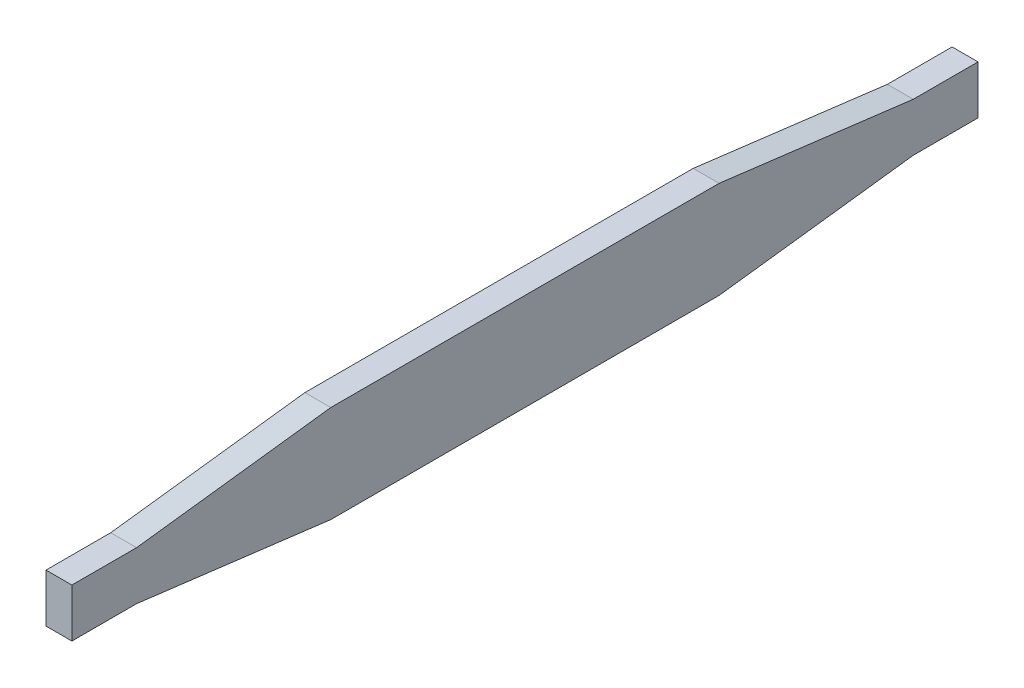
ISO-10303-21;
HEADER;
FILE_DESCRIPTION(('STEP AP214'),'2;1');
FILE_NAME('part.step','',(''),(''),'','','');
FILE_SCHEMA(('AUTOMOTIVE_DESIGN { 1 0 10303 214 1 1 1 1 }'));
ENDSEC;
DATA;
#1=APPLICATION_CONTEXT('core data for automotive mechanical design processes');
#2=APPLICATION_PROTOCOL_DEFINITION('international standard','automotive_design',2000,#1);
#3=PRODUCT_CONTEXT('',#1,'mechanical');
#4=PRODUCT('Part','Part','',(#3));
#5=PRODUCT_RELATED_PRODUCT_CATEGORY('part','',(#4));
#6=PRODUCT_DEFINITION_FORMATION('','',#4);
#7=PRODUCT_DEFINITION_CONTEXT('part definition',#1,'design');
#8=PRODUCT_DEFINITION('design','',#6,#7);
#9=PRODUCT_DEFINITION_SHAPE('','',#8);
#10=(LENGTH_UNIT() NAMED_UNIT(*) SI_UNIT(.MILLI.,.METRE.));
#11=(NAMED_UNIT(*) PLANE_ANGLE_UNIT() SI_UNIT($,.RADIAN.));
#12=(NAMED_UNIT(*) SI_UNIT($,.STERADIAN.) SOLID_ANGLE_UNIT());
#13=UNCERTAINTY_MEASURE_WITH_UNIT(LENGTH_MEASURE(1.E-05),#10,'distance_accuracy_value','');
#14=(GEOMETRIC_REPRESENTATION_CONTEXT(3) GLOBAL_UNCERTAINTY_ASSIGNED_CONTEXT((#13)) GLOBAL_UNIT_ASSIGNED_CONTEXT((#10,
#11,#12)) REPRESENTATION_CONTEXT('',''));
#15=CARTESIAN_POINT('',(0.,0.,0.));
#16=DIRECTION('',(0.,0.,1.));
#17=DIRECTION('',(1.,0.,0.));
#18=AXIS2_PLACEMENT_3D('',#15,#16,#17);
#19=CARTESIAN_POINT('',(4.,-7.5,0.));
#20=DIRECTION('',(0.,1.,0.));
#21=DIRECTION('',(0.,0.,1.));
#22=AXIS2_PLACEMENT_3D('',#19,#20,#21);
#23=PLANE('',#22);
#24=DIRECTION('',(0.,0.,-1.));
#25=VECTOR('',#24,1.);
#26=CARTESIAN_POINT('',(0.,-7.5,0.));
#27=LINE('',#26,#25);
#28=CARTESIAN_POINT('',(0.,-7.5,30.));
#29=VERTEX_POINT('',#28);
#30=CARTESIAN_POINT('',(0.,-7.5,-30.));
#31=VERTEX_POINT('',#30);
#32=EDGE_CURVE('E152',#29,#31,#27,.T.);
#33=ORIENTED_EDGE('',*,*,#32,.T.);
#34=DIRECTION('',(-1.,0.,0.));
#35=VECTOR('',#34,1.);
#36=CARTESIAN_POINT('',(4.,-7.5,-30.));
#37=LINE('',#36,#35);
#38=CARTESIAN_POINT('',(4.,-7.5,-30.));
#39=VERTEX_POINT('',#38);
#40=EDGE_CURVE('E11',#39,#31,#37,.T.);
#41=ORIENTED_EDGE('',*,*,#40,.F.);
#42=DIRECTION('',(0.,0.,-1.));
#43=VECTOR('',#42,1.);
#44=CARTESIAN_POINT('',(4.,-7.5,0.));
#45=LINE('',#44,#43);
#46=CARTESIAN_POINT('',(4.,-7.5,30.));
#47=VERTEX_POINT('',#46);
#48=EDGE_CURVE('E99',#47,#39,#45,.T.);
#49=ORIENTED_EDGE('',*,*,#48,.F.);
#50=DIRECTION('',(-1.,0.,0.));
#51=VECTOR('',#50,1.);
#52=CARTESIAN_POINT('',(4.,-7.5,30.));
#53=LINE('',#52,#51);
#54=EDGE_CURVE('E148',#47,#29,#53,.T.);
#55=ORIENTED_EDGE('',*,*,#54,.T.);
#56=EDGE_LOOP('',(#33,#41,#49,#55));
#57=FACE_BOUND('',#56,.T.);
#58=ADVANCED_FACE('F35',(#57),#23,.F.);
#59=CARTESIAN_POINT('',(4.,-11.0769230769231,-1.38461538461538));
#60=DIRECTION('',(0.,-0.992277876713668,-0.124034734589208));
#61=DIRECTION('',(0.,0.124034734589208,-0.992277876713668));
#62=AXIS2_PLACEMENT_3D('',#59,#60,#61);
#63=PLANE('',#62);
#64=DIRECTION('',(0.,-0.124034734589208,0.992277876713668));
#65=VECTOR('',#64,1.);
#66=CARTESIAN_POINT('',(0.,-11.0769230769231,-1.38461538461538));
#67=LINE('',#66,#65);
#68=CARTESIAN_POINT('',(0.,-3.75,-60.));
#69=VERTEX_POINT('',#68);
#70=EDGE_CURVE('E155',#69,#31,#67,.T.);
#71=ORIENTED_EDGE('',*,*,#70,.F.);
#72=DIRECTION('',(-1.,0.,0.));
#73=VECTOR('',#72,1.);
#74=CARTESIAN_POINT('',(4.,-3.75,-60.));
#75=LINE('',#74,#73);
#76=CARTESIAN_POINT('',(4.,-3.75,-60.));
#77=VERTEX_POINT('',#76);
#78=EDGE_CURVE('E43',#77,#69,#75,.T.);
#79=ORIENTED_EDGE('',*,*,#78,.F.);
#80=DIRECTION('',(0.,-0.124034734589208,0.992277876713668));
#81=VECTOR('',#80,1.);
#82=CARTESIAN_POINT('',(4.,-11.0769230769231,-1.38461538461538));
#83=LINE('',#82,#81);
#84=EDGE_CURVE('E211',#77,#39,#83,.T.);
#85=ORIENTED_EDGE('',*,*,#84,.T.);
#86=ORIENTED_EDGE('',*,*,#40,.T.);
#87=EDGE_LOOP('',(#71,#79,#85,#86));
#88=FACE_BOUND('',#87,.T.);
#89=ADVANCED_FACE('F210',(#88),#63,.T.);
#90=CARTESIAN_POINT('',(4.,-3.75,0.));
#91=DIRECTION('',(0.,1.,0.));
#92=DIRECTION('',(0.,0.,1.));
#93=AXIS2_PLACEMENT_3D('',#90,#91,#92);
#94=PLANE('',#93);
#95=DIRECTION('',(0.,0.,-1.));
#96=VECTOR('',#95,1.);
#97=CARTESIAN_POINT('',(0.,-3.75,0.));
#98=LINE('',#97,#96);
#99=CARTESIAN_POINT('',(0.,-3.75,-70.));
#100=VERTEX_POINT('',#99);
#101=EDGE_CURVE('E158',#69,#100,#98,.T.);
#102=ORIENTED_EDGE('',*,*,#101,.T.);
#103=DIRECTION('',(-1.,0.,0.));
#104=VECTOR('',#103,1.);
#105=CARTESIAN_POINT('',(4.,-3.75,-70.));
#106=LINE('',#105,#104);
#107=CARTESIAN_POINT('',(4.,-3.75,-70.));
#108=VERTEX_POINT('',#107);
#109=EDGE_CURVE('E195',#108,#100,#106,.T.);
#110=ORIENTED_EDGE('',*,*,#109,.F.);
#111=DIRECTION('',(0.,0.,-1.));
#112=VECTOR('',#111,1.);
#113=CARTESIAN_POINT('',(4.,-3.75,0.));
#114=LINE('',#113,#112);
#115=EDGE_CURVE('E202',#77,#108,#114,.T.);
#116=ORIENTED_EDGE('',*,*,#115,.F.);
#117=ORIENTED_EDGE('',*,*,#78,.T.);
#118=EDGE_LOOP('',(#102,#110,#116,#117));
#119=FACE_BOUND('',#118,.T.);
#120=ADVANCED_FACE('F200',(#119),#94,.F.);
#121=CARTESIAN_POINT('',(4.,0.,-70.));
#122=DIRECTION('',(0.,0.,1.));
#123=DIRECTION('',(1.,0.,0.));
#124=AXIS2_PLACEMENT_3D('',#121,#122,#123);
#125=PLANE('',#124);
#126=DIRECTION('',(0.,1.,0.));
#127=VECTOR('',#126,1.);
#128=CARTESIAN_POINT('',(0.,0.,-70.));
#129=LINE('',#128,#127);
#130=CARTESIAN_POINT('',(0.,3.75,-70.));
#131=VERTEX_POINT('',#130);
#132=EDGE_CURVE('E160',#100,#131,#129,.T.);
#133=ORIENTED_EDGE('',*,*,#132,.T.);
#134=DIRECTION('',(-1.,0.,0.));
#135=VECTOR('',#134,1.);
#136=CARTESIAN_POINT('',(4.,3.75,-70.));
#137=LINE('',#136,#135);
#138=CARTESIAN_POINT('',(4.,3.75,-70.));
#139=VERTEX_POINT('',#138);
#140=EDGE_CURVE('E193',#139,#131,#137,.T.);
#141=ORIENTED_EDGE('',*,*,#140,.F.);
#142=DIRECTION('',(0.,1.,0.));
#143=VECTOR('',#142,1.);
#144=CARTESIAN_POINT('',(4.,0.,-70.));
#145=LINE('',#144,#143);
#146=EDGE_CURVE('E244',#108,#139,#145,.T.);
#147=ORIENTED_EDGE('',*,*,#146,.F.);
#148=ORIENTED_EDGE('',*,*,#109,.T.);
#149=EDGE_LOOP('',(#133,#141,#147,#148));
#150=FACE_BOUND('',#149,.T.);
#151=ADVANCED_FACE('F243',(#150),#125,.F.);
#152=CARTESIAN_POINT('',(4.,3.75,0.));
#153=DIRECTION('',(0.,1.,0.));
#154=DIRECTION('',(0.,0.,1.));
#155=AXIS2_PLACEMENT_3D('',#152,#153,#154);
#156=PLANE('',#155);
#157=DIRECTION('',(0.,0.,-1.));
#158=VECTOR('',#157,1.);
#159=CARTESIAN_POINT('',(0.,3.75,0.));
#160=LINE('',#159,#158);
#161=CARTESIAN_POINT('',(0.,3.75,-60.));
#162=VERTEX_POINT('',#161);
#163=EDGE_CURVE('E163',#162,#131,#160,.T.);
#164=ORIENTED_EDGE('',*,*,#163,.F.);
#165=DIRECTION('',(-1.,0.,0.));
#166=VECTOR('',#165,1.);
#167=CARTESIAN_POINT('',(4.,3.75,-60.));
#168=LINE('',#167,#166);
#169=CARTESIAN_POINT('',(4.,3.75,-60.));
#170=VERTEX_POINT('',#169);
#171=EDGE_CURVE('E191',#170,#162,#168,.T.);
#172=ORIENTED_EDGE('',*,*,#171,.F.);
#173=DIRECTION('',(0.,0.,-1.));
#174=VECTOR('',#173,1.);
#175=CARTESIAN_POINT('',(4.,3.75,0.));
#176=LINE('',#175,#174);
#177=EDGE_CURVE('E240',#170,#139,#176,.T.);
#178=ORIENTED_EDGE('',*,*,#177,.T.);
#179=ORIENTED_EDGE('',*,*,#140,.T.);
#180=EDGE_LOOP('',(#164,#172,#178,#179));
#181=FACE_BOUND('',#180,.T.);
#182=ADVANCED_FACE('F238',(#181),#156,.T.);
#183=CARTESIAN_POINT('',(4.,11.0769230769231,-1.38461538461539));
#184=DIRECTION('',(0.,0.992277876713668,-0.124034734589209));
#185=DIRECTION('',(0.,0.124034734589209,0.992277876713668));
#186=AXIS2_PLACEMENT_3D('',#183,#184,#185);
#187=PLANE('',#186);
#188=DIRECTION('',(0.,-0.124034734589209,-0.992277876713668));
#189=VECTOR('',#188,1.);
#190=CARTESIAN_POINT('',(0.,11.0769230769231,-1.38461538461539));
#191=LINE('',#190,#189);
#192=CARTESIAN_POINT('',(0.,7.5,-30.));
#193=VERTEX_POINT('',#192);
#194=EDGE_CURVE('E166',#193,#162,#191,.T.);
#195=ORIENTED_EDGE('',*,*,#194,.F.);
#196=DIRECTION('',(-1.,0.,0.));
#197=VECTOR('',#196,1.);
#198=CARTESIAN_POINT('',(4.,7.5,-30.));
#199=LINE('',#198,#197);
#200=CARTESIAN_POINT('',(4.,7.5,-30.));
#201=VERTEX_POINT('',#200);
#202=EDGE_CURVE('E189',#201,#193,#199,.T.);
#203=ORIENTED_EDGE('',*,*,#202,.F.);
#204=DIRECTION('',(0.,-0.124034734589209,-0.992277876713668));
#205=VECTOR('',#204,1.);
#206=CARTESIAN_POINT('',(4.,11.0769230769231,-1.38461538461539));
#207=LINE('',#206,#205);
#208=EDGE_CURVE('E234',#201,#170,#207,.T.);
#209=ORIENTED_EDGE('',*,*,#208,.T.);
#210=ORIENTED_EDGE('',*,*,#171,.T.);
#211=EDGE_LOOP('',(#195,#203,#209,#210));
#212=FACE_BOUND('',#211,.T.);
#213=ADVANCED_FACE('F231',(#212),#187,.T.);
#214=CARTESIAN_POINT('',(4.,7.5,0.));
#215=DIRECTION('',(0.,1.,0.));
#216=DIRECTION('',(0.,0.,1.));
#217=AXIS2_PLACEMENT_3D('',#214,#215,#216);
#218=PLANE('',#217);
#219=DIRECTION('',(0.,0.,-1.));
#220=VECTOR('',#219,1.);
#221=CARTESIAN_POINT('',(0.,7.5,0.));
#222=LINE('',#221,#220);
#223=CARTESIAN_POINT('',(0.,7.5,30.));
#224=VERTEX_POINT('',#223);
#225=EDGE_CURVE('E169',#224,#193,#222,.T.);
#226=ORIENTED_EDGE('',*,*,#225,.F.);
#227=DIRECTION('',(-1.,0.,0.));
#228=VECTOR('',#227,1.);
#229=CARTESIAN_POINT('',(4.,7.5,30.));
#230=LINE('',#229,#228);
#231=CARTESIAN_POINT('',(4.,7.5,30.));
#232=VERTEX_POINT('',#231);
#233=EDGE_CURVE('E187',#232,#224,#230,.T.);
#234=ORIENTED_EDGE('',*,*,#233,.F.);
#235=DIRECTION('',(0.,0.,-1.));
#236=VECTOR('',#235,1.);
#237=CARTESIAN_POINT('',(4.,7.5,0.));
#238=LINE('',#237,#236);
#239=EDGE_CURVE('E227',#232,#201,#238,.T.);
#240=ORIENTED_EDGE('',*,*,#239,.T.);
#241=ORIENTED_EDGE('',*,*,#202,.T.);
#242=EDGE_LOOP('',(#226,#234,#240,#241));
#243=FACE_BOUND('',#242,.T.);
#244=ADVANCED_FACE('F226',(#243),#218,.T.);
#245=CARTESIAN_POINT('',(4.,11.0769230769231,1.38461538461539));
#246=DIRECTION('',(0.,-0.992277876713668,-0.124034734589208));
#247=DIRECTION('',(0.,0.124034734589208,-0.992277876713668));
#248=AXIS2_PLACEMENT_3D('',#245,#246,#247);
#249=PLANE('',#248);
#250=DIRECTION('',(0.,-0.124034734589208,0.992277876713668));
#251=VECTOR('',#250,1.);
#252=CARTESIAN_POINT('',(0.,11.0769230769231,1.38461538461539));
#253=LINE('',#252,#251);
#254=CARTESIAN_POINT('',(0.,3.75,60.));
#255=VERTEX_POINT('',#254);
#256=EDGE_CURVE('E172',#224,#255,#253,.T.);
#257=ORIENTED_EDGE('',*,*,#256,.T.);
#258=DIRECTION('',(-1.,0.,0.));
#259=VECTOR('',#258,1.);
#260=CARTESIAN_POINT('',(4.,3.75,60.));
#261=LINE('',#260,#259);
#262=CARTESIAN_POINT('',(4.,3.75,60.));
#263=VERTEX_POINT('',#262);
#264=EDGE_CURVE('E184',#263,#255,#261,.T.);
#265=ORIENTED_EDGE('',*,*,#264,.F.);
#266=DIRECTION('',(0.,-0.124034734589208,0.992277876713668));
#267=VECTOR('',#266,1.);
#268=CARTESIAN_POINT('',(4.,11.0769230769231,1.38461538461539));
#269=LINE('',#268,#267);
#270=EDGE_CURVE('E222',#232,#263,#269,.T.);
#271=ORIENTED_EDGE('',*,*,#270,.F.);
#272=ORIENTED_EDGE('',*,*,#233,.T.);
#273=EDGE_LOOP('',(#257,#265,#271,#272));
#274=FACE_BOUND('',#273,.T.);
#275=ADVANCED_FACE('F221',(#274),#249,.F.);
#276=CARTESIAN_POINT('',(4.,3.75,0.));
#277=DIRECTION('',(0.,-1.,0.));
#278=DIRECTION('',(0.,0.,-1.));
#279=AXIS2_PLACEMENT_3D('',#276,#277,#278);
#280=PLANE('',#279);
#281=DIRECTION('',(0.,0.,1.));
#282=VECTOR('',#281,1.);
#283=CARTESIAN_POINT('',(0.,3.75,0.));
#284=LINE('',#283,#282);
#285=CARTESIAN_POINT('',(0.,3.75,70.));
#286=VERTEX_POINT('',#285);
#287=EDGE_CURVE('E174',#255,#286,#284,.T.);
#288=ORIENTED_EDGE('',*,*,#287,.T.);
#289=DIRECTION('',(-1.,0.,0.));
#290=VECTOR('',#289,1.);
#291=CARTESIAN_POINT('',(4.,3.75,70.));
#292=LINE('',#291,#290);
#293=CARTESIAN_POINT('',(4.,3.75,70.));
#294=VERTEX_POINT('',#293);
#295=EDGE_CURVE('E138',#294,#286,#292,.T.);
#296=ORIENTED_EDGE('',*,*,#295,.F.);
#297=DIRECTION('',(0.,0.,1.));
#298=VECTOR('',#297,1.);
#299=CARTESIAN_POINT('',(4.,3.75,0.));
#300=LINE('',#299,#298);
#301=EDGE_CURVE('E143',#263,#294,#300,.T.);
#302=ORIENTED_EDGE('',*,*,#301,.F.);
#303=ORIENTED_EDGE('',*,*,#264,.T.);
#304=EDGE_LOOP('',(#288,#296,#302,#303));
#305=FACE_BOUND('',#304,.T.);
#306=ADVANCED_FACE('F217',(#305),#280,.F.);
#307=CARTESIAN_POINT('',(4.,0.,70.));
#308=DIRECTION('',(0.,0.,1.));
#309=DIRECTION('',(1.,0.,0.));
#310=AXIS2_PLACEMENT_3D('',#307,#308,#309);
#311=PLANE('',#310);
#312=DIRECTION('',(0.,1.,0.));
#313=VECTOR('',#312,1.);
#314=CARTESIAN_POINT('',(0.,0.,70.));
#315=LINE('',#314,#313);
#316=CARTESIAN_POINT('',(0.,-3.75,70.));
#317=VERTEX_POINT('',#316);
#318=EDGE_CURVE('E133',#317,#286,#315,.T.);
#319=ORIENTED_EDGE('',*,*,#318,.F.);
#320=DIRECTION('',(-1.,0.,0.));
#321=VECTOR('',#320,1.);
#322=CARTESIAN_POINT('',(4.,-3.75,70.));
#323=LINE('',#322,#321);
#324=CARTESIAN_POINT('',(4.,-3.75,70.));
#325=VERTEX_POINT('',#324);
#326=EDGE_CURVE('E128',#325,#317,#323,.T.);
#327=ORIENTED_EDGE('',*,*,#326,.F.);
#328=DIRECTION('',(0.,1.,0.));
#329=VECTOR('',#328,1.);
#330=CARTESIAN_POINT('',(4.,0.,70.));
#331=LINE('',#330,#329);
#332=EDGE_CURVE('E131',#325,#294,#331,.T.);
#333=ORIENTED_EDGE('',*,*,#332,.T.);
#334=ORIENTED_EDGE('',*,*,#295,.T.);
#335=EDGE_LOOP('',(#319,#327,#333,#334));
#336=FACE_BOUND('',#335,.T.);
#337=ADVANCED_FACE('F130',(#336),#311,.T.);
#338=CARTESIAN_POINT('',(4.,-3.75,0.));
#339=DIRECTION('',(0.,-1.,0.));
#340=DIRECTION('',(0.,0.,-1.));
#341=AXIS2_PLACEMENT_3D('',#338,#339,#340);
#342=PLANE('',#341);
#343=DIRECTION('',(0.,0.,1.));
#344=VECTOR('',#343,1.);
#345=CARTESIAN_POINT('',(0.,-3.75,0.));
#346=LINE('',#345,#344);
#347=CARTESIAN_POINT('',(0.,-3.75,60.));
#348=VERTEX_POINT('',#347);
#349=EDGE_CURVE('E178',#348,#317,#346,.T.);
#350=ORIENTED_EDGE('',*,*,#349,.F.);
#351=DIRECTION('',(-1.,0.,0.));
#352=VECTOR('',#351,1.);
#353=CARTESIAN_POINT('',(4.,-3.75,60.));
#354=LINE('',#353,#352);
#355=CARTESIAN_POINT('',(4.,-3.75,60.));
#356=VERTEX_POINT('',#355);
#357=EDGE_CURVE('E90',#356,#348,#354,.T.);
#358=ORIENTED_EDGE('',*,*,#357,.F.);
#359=DIRECTION('',(0.,0.,1.));
#360=VECTOR('',#359,1.);
#361=CARTESIAN_POINT('',(4.,-3.75,0.));
#362=LINE('',#361,#360);
#363=EDGE_CURVE('E141',#356,#325,#362,.T.);
#364=ORIENTED_EDGE('',*,*,#363,.T.);
#365=ORIENTED_EDGE('',*,*,#326,.T.);
#366=EDGE_LOOP('',(#350,#358,#364,#365));
#367=FACE_BOUND('',#366,.T.);
#368=ADVANCED_FACE('F146',(#367),#342,.T.);
#369=CARTESIAN_POINT('',(4.,-11.0769230769231,1.38461538461538));
#370=DIRECTION('',(0.,0.992277876713668,-0.124034734589208));
#371=DIRECTION('',(0.,0.124034734589208,0.992277876713668));
#372=AXIS2_PLACEMENT_3D('',#369,#370,#371);
#373=PLANE('',#372);
#374=DIRECTION('',(0.,-0.124034734589208,-0.992277876713668));
#375=VECTOR('',#374,1.);
#376=CARTESIAN_POINT('',(0.,-11.0769230769231,1.38461538461538));
#377=LINE('',#376,#375);
#378=EDGE_CURVE('E93',#348,#29,#377,.T.);
#379=ORIENTED_EDGE('',*,*,#378,.T.);
#380=ORIENTED_EDGE('',*,*,#54,.F.);
#381=DIRECTION('',(0.,-0.124034734589208,-0.992277876713668));
#382=VECTOR('',#381,1.);
#383=CARTESIAN_POINT('',(4.,-11.0769230769231,1.38461538461538));
#384=LINE('',#383,#382);
#385=EDGE_CURVE('E51',#356,#47,#384,.T.);
#386=ORIENTED_EDGE('',*,*,#385,.F.);
#387=ORIENTED_EDGE('',*,*,#357,.T.);
#388=EDGE_LOOP('',(#379,#380,#386,#387));
#389=FACE_BOUND('',#388,.T.);
#390=ADVANCED_FACE('F330',(#389),#373,.F.);
#391=CARTESIAN_POINT('',(4.,0.,0.));
#392=DIRECTION('',(1.,0.,0.));
#393=DIRECTION('',(0.,0.,-1.));
#394=AXIS2_PLACEMENT_3D('',#391,#392,#393);
#395=PLANE('',#394);
#396=ORIENTED_EDGE('',*,*,#48,.T.);
#397=ORIENTED_EDGE('',*,*,#84,.F.);
#398=ORIENTED_EDGE('',*,*,#115,.T.);
#399=ORIENTED_EDGE('',*,*,#146,.T.);
#400=ORIENTED_EDGE('',*,*,#177,.F.);
#401=ORIENTED_EDGE('',*,*,#208,.F.);
#402=ORIENTED_EDGE('',*,*,#239,.F.);
#403=ORIENTED_EDGE('',*,*,#270,.T.);
#404=ORIENTED_EDGE('',*,*,#301,.T.);
#405=ORIENTED_EDGE('',*,*,#332,.F.);
#406=ORIENTED_EDGE('',*,*,#363,.F.);
#407=ORIENTED_EDGE('',*,*,#385,.T.);
#408=EDGE_LOOP('',(#396,#397,#398,#399,#400,#401,#402,#403,#404,#405,#406,#407));
#409=FACE_BOUND('',#408,.T.);
#410=ADVANCED_FACE('F140',(#409),#395,.T.);
#411=CARTESIAN_POINT('',(0.,0.,0.));
#412=DIRECTION('',(1.,0.,0.));
#413=DIRECTION('',(0.,0.,-1.));
#414=AXIS2_PLACEMENT_3D('',#411,#412,#413);
#415=PLANE('',#414);
#416=ORIENTED_EDGE('',*,*,#32,.F.);
#417=ORIENTED_EDGE('',*,*,#378,.F.);
#418=ORIENTED_EDGE('',*,*,#349,.T.);
#419=ORIENTED_EDGE('',*,*,#318,.T.);
#420=ORIENTED_EDGE('',*,*,#287,.F.);
#421=ORIENTED_EDGE('',*,*,#256,.F.);
#422=ORIENTED_EDGE('',*,*,#225,.T.);
#423=ORIENTED_EDGE('',*,*,#194,.T.);
#424=ORIENTED_EDGE('',*,*,#163,.T.);
#425=ORIENTED_EDGE('',*,*,#132,.F.);
#426=ORIENTED_EDGE('',*,*,#101,.F.);
#427=ORIENTED_EDGE('',*,*,#70,.T.);
#428=EDGE_LOOP('',(#416,#417,#418,#419,#420,#421,#422,#423,#424,#425,#426,#427));
#429=FACE_BOUND('',#428,.T.);
#430=ADVANCED_FACE('F209',(#429),#415,.F.);
#431=CLOSED_SHELL('',(#58,#89,#120,#151,#182,#213,#244,#275,#306,#337,#368,#390,#410,#430));
#432=MANIFOLD_SOLID_BREP('B2',#431);
#433=ADVANCED_BREP_SHAPE_REPRESENTATION('',(#18,#432),#14);
#434=SHAPE_DEFINITION_REPRESENTATION(#9,#433);
ENDSEC;
END-ISO-10303-21;
